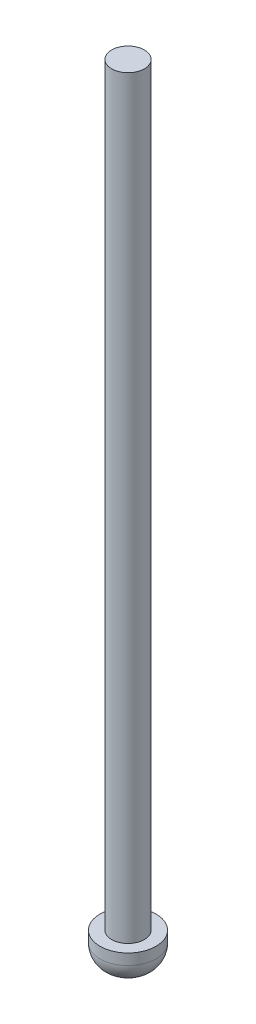
ISO-10303-21;
HEADER;
FILE_DESCRIPTION(('STEP AP214'),'2;1');
FILE_NAME('part.step','',(''),(''),'','','');
FILE_SCHEMA(('AUTOMOTIVE_DESIGN { 1 0 10303 214 1 1 1 1 }'));
ENDSEC;
DATA;
#1=APPLICATION_CONTEXT('core data for automotive mechanical design processes');
#2=APPLICATION_PROTOCOL_DEFINITION('international standard','automotive_design',2000,#1);
#3=PRODUCT_CONTEXT('',#1,'mechanical');
#4=PRODUCT('Part','Part','',(#3));
#5=PRODUCT_RELATED_PRODUCT_CATEGORY('part','',(#4));
#6=PRODUCT_DEFINITION_FORMATION('','',#4);
#7=PRODUCT_DEFINITION_CONTEXT('part definition',#1,'design');
#8=PRODUCT_DEFINITION('design','',#6,#7);
#9=PRODUCT_DEFINITION_SHAPE('','',#8);
#10=(LENGTH_UNIT() NAMED_UNIT(*) SI_UNIT(.MILLI.,.METRE.));
#11=(NAMED_UNIT(*) PLANE_ANGLE_UNIT() SI_UNIT($,.RADIAN.));
#12=(NAMED_UNIT(*) SI_UNIT($,.STERADIAN.) SOLID_ANGLE_UNIT());
#13=UNCERTAINTY_MEASURE_WITH_UNIT(LENGTH_MEASURE(1.E-05),#10,'distance_accuracy_value','');
#14=(GEOMETRIC_REPRESENTATION_CONTEXT(3) GLOBAL_UNCERTAINTY_ASSIGNED_CONTEXT((#13)) GLOBAL_UNIT_ASSIGNED_CONTEXT((#10,
#11,#12)) REPRESENTATION_CONTEXT('',''));
#15=CARTESIAN_POINT('',(0.,0.,0.));
#16=DIRECTION('',(0.,0.,1.));
#17=DIRECTION('',(1.,0.,0.));
#18=AXIS2_PLACEMENT_3D('',#15,#16,#17);
#19=CARTESIAN_POINT('',(0.,794.82,0.));
#20=DIRECTION('',(0.,-1.,0.));
#21=DIRECTION('',(0.,0.,-1.));
#22=AXIS2_PLACEMENT_3D('',#19,#20,#21);
#23=CYLINDRICAL_SURFACE('',#22,17.25);
#24=CARTESIAN_POINT('',(0.,794.82,0.));
#25=DIRECTION('',(0.,1.,0.));
#26=DIRECTION('',(0.,0.,1.));
#27=AXIS2_PLACEMENT_3D('',#24,#25,#26);
#28=CIRCLE('',#27,17.25);
#29=CARTESIAN_POINT('',(0.,794.82,17.25));
#30=VERTEX_POINT('',#29);
#31=EDGE_CURVE('E44',#30,#30,#28,.T.);
#32=ORIENTED_EDGE('',*,*,#31,.F.);
#33=EDGE_LOOP('',(#32));
#34=FACE_BOUND('',#33,.T.);
#35=CARTESIAN_POINT('',(0.,0.,0.));
#36=DIRECTION('',(0.,1.,0.));
#37=DIRECTION('',(0.,0.,1.));
#38=AXIS2_PLACEMENT_3D('',#35,#36,#37);
#39=CIRCLE('',#38,17.25);
#40=CARTESIAN_POINT('',(0.,0.,17.25));
#41=VERTEX_POINT('',#40);
#42=EDGE_CURVE('E48',#41,#41,#39,.T.);
#43=ORIENTED_EDGE('',*,*,#42,.T.);
#44=EDGE_LOOP('',(#43));
#45=FACE_BOUND('',#44,.T.);
#46=ADVANCED_FACE('F33',(#34,#45),#23,.T.);
#47=CARTESIAN_POINT('',(0.,794.82,0.));
#48=DIRECTION('',(0.,1.,0.));
#49=DIRECTION('',(0.,0.,1.));
#50=AXIS2_PLACEMENT_3D('',#47,#48,#49);
#51=PLANE('',#50);
#52=ORIENTED_EDGE('',*,*,#31,.T.);
#53=EDGE_LOOP('',(#52));
#54=FACE_BOUND('',#53,.T.);
#55=ADVANCED_FACE('F74',(#54),#51,.T.);
#56=CARTESIAN_POINT('',(0.,-33.5,0.));
#57=DIRECTION('',(0.,1.,0.));
#58=DIRECTION('',(0.,0.,1.));
#59=AXIS2_PLACEMENT_3D('',#56,#57,#58);
#60=CYLINDRICAL_SURFACE('',#59,29.5);
#61=CARTESIAN_POINT('',(0.,-11.5,0.));
#62=DIRECTION('',(0.,-1.,0.));
#63=DIRECTION('',(0.,0.,-1.));
#64=AXIS2_PLACEMENT_3D('',#61,#62,#63);
#65=CIRCLE('',#64,29.5);
#66=CARTESIAN_POINT('',(0.,-11.5,-29.5));
#67=VERTEX_POINT('',#66);
#68=EDGE_CURVE('E10',#67,#67,#65,.F.);
#69=ORIENTED_EDGE('',*,*,#68,.T.);
#70=EDGE_LOOP('',(#69));
#71=FACE_BOUND('',#70,.T.);
#72=CARTESIAN_POINT('',(0.,0.,0.));
#73=DIRECTION('',(0.,-1.,0.));
#74=DIRECTION('',(0.,0.,-1.));
#75=AXIS2_PLACEMENT_3D('',#72,#73,#74);
#76=CIRCLE('',#75,29.5);
#77=CARTESIAN_POINT('',(0.,0.,-29.5));
#78=VERTEX_POINT('',#77);
#79=EDGE_CURVE('E52',#78,#78,#76,.T.);
#80=ORIENTED_EDGE('',*,*,#79,.T.);
#81=EDGE_LOOP('',(#80));
#82=FACE_BOUND('',#81,.T.);
#83=ADVANCED_FACE('F57',(#71,#82),#60,.T.);
#84=CARTESIAN_POINT('',(0.,-33.5,0.));
#85=DIRECTION('',(0.,-1.,0.));
#86=DIRECTION('',(0.,0.,-1.));
#87=AXIS2_PLACEMENT_3D('',#84,#85,#86);
#88=PLANE('',#87);
#89=CARTESIAN_POINT('',(0.,-33.5,0.));
#90=DIRECTION('',(0.,-1.,0.));
#91=DIRECTION('',(0.,0.,-1.));
#92=AXIS2_PLACEMENT_3D('',#89,#90,#91);
#93=CIRCLE('',#92,7.5);
#94=CARTESIAN_POINT('',(0.,-33.5,-7.5));
#95=VERTEX_POINT('',#94);
#96=EDGE_CURVE('E40',#95,#95,#93,.T.);
#97=ORIENTED_EDGE('',*,*,#96,.T.);
#98=EDGE_LOOP('',(#97));
#99=FACE_BOUND('',#98,.T.);
#100=ADVANCED_FACE('F61',(#99),#88,.T.);
#101=CARTESIAN_POINT('',(0.,0.,0.));
#102=DIRECTION('',(0.,-1.,0.));
#103=DIRECTION('',(0.,0.,-1.));
#104=AXIS2_PLACEMENT_3D('',#101,#102,#103);
#105=PLANE('',#104);
#106=ORIENTED_EDGE('',*,*,#42,.F.);
#107=EDGE_LOOP('',(#106));
#108=FACE_BOUND('',#107,.T.);
#109=ORIENTED_EDGE('',*,*,#79,.F.);
#110=EDGE_LOOP('',(#109));
#111=FACE_BOUND('',#110,.T.);
#112=ADVANCED_FACE('F59',(#108,#111),#105,.F.);
#113=CARTESIAN_POINT('',(0.,-11.5,0.));
#114=DIRECTION('',(0.,-1.,0.));
#115=DIRECTION('',(0.,0.,-1.));
#116=AXIS2_PLACEMENT_3D('',#113,#114,#115);
#117=DEGENERATE_TOROIDAL_SURFACE('',#116,7.5,22.,.T.);
#118=ORIENTED_EDGE('',*,*,#68,.F.);
#119=EDGE_LOOP('',(#118));
#120=FACE_BOUND('',#119,.T.);
#121=ORIENTED_EDGE('',*,*,#96,.F.);
#122=EDGE_LOOP('',(#121));
#123=FACE_BOUND('',#122,.T.);
#124=ADVANCED_FACE('F35',(#120,#123),#117,.T.);
#125=CLOSED_SHELL('',(#46,#55,#83,#100,#112,#124));
#126=MANIFOLD_SOLID_BREP('B2',#125);
#127=ADVANCED_BREP_SHAPE_REPRESENTATION('',(#18,#126),#14);
#128=SHAPE_DEFINITION_REPRESENTATION(#9,#127);
ENDSEC;
END-ISO-10303-21;
